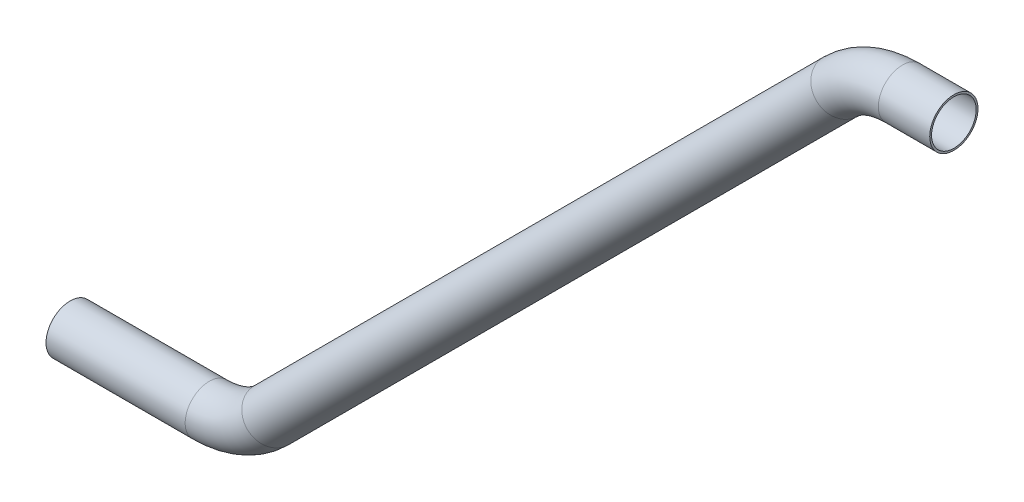
ISO-10303-21;
HEADER;
FILE_DESCRIPTION(('STEP AP214'),'2;1');
FILE_NAME('part.step','',(''),(''),'','','');
FILE_SCHEMA(('AUTOMOTIVE_DESIGN { 1 0 10303 214 1 1 1 1 }'));
ENDSEC;
DATA;
#1=APPLICATION_CONTEXT('core data for automotive mechanical design processes');
#2=APPLICATION_PROTOCOL_DEFINITION('international standard','automotive_design',2000,#1);
#3=PRODUCT_CONTEXT('',#1,'mechanical');
#4=PRODUCT('Part','Part','',(#3));
#5=PRODUCT_RELATED_PRODUCT_CATEGORY('part','',(#4));
#6=PRODUCT_DEFINITION_FORMATION('','',#4);
#7=PRODUCT_DEFINITION_CONTEXT('part definition',#1,'design');
#8=PRODUCT_DEFINITION('design','',#6,#7);
#9=PRODUCT_DEFINITION_SHAPE('','',#8);
#10=(LENGTH_UNIT() NAMED_UNIT(*) SI_UNIT(.MILLI.,.METRE.));
#11=(NAMED_UNIT(*) PLANE_ANGLE_UNIT() SI_UNIT($,.RADIAN.));
#12=(NAMED_UNIT(*) SI_UNIT($,.STERADIAN.) SOLID_ANGLE_UNIT());
#13=UNCERTAINTY_MEASURE_WITH_UNIT(LENGTH_MEASURE(1.E-05),#10,'distance_accuracy_value','');
#14=(GEOMETRIC_REPRESENTATION_CONTEXT(3) GLOBAL_UNCERTAINTY_ASSIGNED_CONTEXT((#13)) GLOBAL_UNIT_ASSIGNED_CONTEXT((#10,
#11,#12)) REPRESENTATION_CONTEXT('',''));
#15=CARTESIAN_POINT('',(0.,0.,0.));
#16=DIRECTION('',(0.,0.,1.));
#17=DIRECTION('',(1.,0.,0.));
#18=AXIS2_PLACEMENT_3D('',#15,#16,#17);
#19=CARTESIAN_POINT('',(0.,0.,0.));
#20=DIRECTION('',(-1.,0.,0.));
#21=DIRECTION('',(0.,0.,1.));
#22=AXIS2_PLACEMENT_3D('',#19,#20,#21);
#23=PLANE('',#22);
#24=CARTESIAN_POINT('',(0.,0.,0.));
#25=DIRECTION('',(-1.,0.,0.));
#26=DIRECTION('',(0.,0.,1.));
#27=AXIS2_PLACEMENT_3D('',#24,#25,#26);
#28=CIRCLE('',#27,41.275);
#29=CARTESIAN_POINT('',(0.,0.,41.275));
#30=VERTEX_POINT('',#29);
#31=EDGE_CURVE('E57',#30,#30,#28,.T.);
#32=ORIENTED_EDGE('',*,*,#31,.T.);
#33=EDGE_LOOP('',(#32));
#34=FACE_BOUND('',#33,.T.);
#35=ADVANCED_FACE('F45',(#34),#23,.T.);
#36=CARTESIAN_POINT('',(1510.66017177982,1060.66017177982,0.));
#37=DIRECTION('',(-1.,0.,0.));
#38=DIRECTION('',(0.,0.,1.));
#39=AXIS2_PLACEMENT_3D('',#36,#37,#38);
#40=PLANE('',#39);
#41=CARTESIAN_POINT('',(1510.66017177982,1060.66017177982,0.));
#42=DIRECTION('',(-1.,0.,0.));
#43=DIRECTION('',(0.,0.,1.));
#44=AXIS2_PLACEMENT_3D('',#41,#42,#43);
#45=CIRCLE('',#44,38.1);
#46=CARTESIAN_POINT('',(1510.66017177982,1060.66017177982,38.1));
#47=VERTEX_POINT('',#46);
#48=EDGE_CURVE('E136',#47,#47,#45,.T.);
#49=ORIENTED_EDGE('',*,*,#48,.T.);
#50=EDGE_LOOP('',(#49));
#51=FACE_BOUND('',#50,.T.);
#52=CARTESIAN_POINT('',(1510.66017177982,1060.66017177982,0.));
#53=DIRECTION('',(-1.,0.,0.));
#54=DIRECTION('',(0.,0.,1.));
#55=AXIS2_PLACEMENT_3D('',#52,#53,#54);
#56=CIRCLE('',#55,41.275);
#57=CARTESIAN_POINT('',(1510.66017177982,1060.66017177982,41.275));
#58=VERTEX_POINT('',#57);
#59=EDGE_CURVE('E12',#58,#58,#56,.T.);
#60=ORIENTED_EDGE('',*,*,#59,.F.);
#61=EDGE_LOOP('',(#60));
#62=FACE_BOUND('',#61,.T.);
#63=ADVANCED_FACE('F63',(#51,#62),#40,.F.);
#64=CARTESIAN_POINT('',(0.,0.,0.));
#65=DIRECTION('',(1.,0.,0.));
#66=DIRECTION('',(0.,1.,0.));
#67=AXIS2_PLACEMENT_3D('',#64,#65,#66);
#68=CYLINDRICAL_SURFACE('',#67,41.275);
#69=CARTESIAN_POINT('',(237.867965644035,0.,0.));
#70=DIRECTION('',(-1.,0.,0.));
#71=DIRECTION('',(0.,0.,1.));
#72=AXIS2_PLACEMENT_3D('',#69,#70,#71);
#73=CIRCLE('',#72,41.275);
#74=CARTESIAN_POINT('',(237.867965644035,-41.2749999999998,0.));
#75=VERTEX_POINT('',#74);
#76=EDGE_CURVE('E139',#75,#75,#73,.T.);
#77=ORIENTED_EDGE('',*,*,#76,.T.);
#78=EDGE_LOOP('',(#77));
#79=FACE_BOUND('',#78,.T.);
#80=ORIENTED_EDGE('',*,*,#31,.F.);
#81=EDGE_LOOP('',(#80));
#82=FACE_BOUND('',#81,.T.);
#83=ADVANCED_FACE('F65',(#79,#82),#68,.T.);
#84=CARTESIAN_POINT('',(237.867965644036,150.,0.));
#85=DIRECTION('',(0.,0.,1.));
#86=DIRECTION('',(1.,0.,0.));
#87=AXIS2_PLACEMENT_3D('',#84,#85,#86);
#88=TOROIDAL_SURFACE('',#87,150.,41.275);
#89=CARTESIAN_POINT('',(343.933982822018,43.933982822018,0.));
#90=DIRECTION('',(-0.707106781186546,-0.707106781186549,0.));
#91=DIRECTION('',(0.,0.,1.));
#92=AXIS2_PLACEMENT_3D('',#89,#90,#91);
#93=CIRCLE('',#92,41.275);
#94=CARTESIAN_POINT('',(373.119815215492,14.7481504285435,0.));
#95=VERTEX_POINT('',#94);
#96=EDGE_CURVE('E142',#95,#95,#93,.T.);
#97=CARTESIAN_POINT('',(237.867965644036,150.,0.));
#98=DIRECTION('',(0.,0.,1.));
#99=DIRECTION('',(1.,0.,0.));
#100=AXIS2_PLACEMENT_3D('',#97,#98,#99);
#101=CIRCLE('',#100,191.275);
#102=EDGE_CURVE('',#75,#95,#101,.T.);
#103=ORIENTED_EDGE('',*,*,#76,.F.);
#104=ORIENTED_EDGE('',*,*,#96,.T.);
#105=ORIENTED_EDGE('',*,*,#102,.T.);
#106=ORIENTED_EDGE('',*,*,#102,.F.);
#107=EDGE_LOOP('',(#103,#105,#104,#106));
#108=FACE_BOUND('',#107,.T.);
#109=ADVANCED_FACE('F71',(#108),#88,.T.);
#110=CARTESIAN_POINT('',(343.933982822018,43.933982822018,0.));
#111=DIRECTION('',(0.707106781186546,0.707106781186549,0.));
#112=DIRECTION('',(-0.707106781186549,0.707106781186546,0.));
#113=AXIS2_PLACEMENT_3D('',#110,#111,#112);
#114=CYLINDRICAL_SURFACE('',#113,41.275);
#115=CARTESIAN_POINT('',(1316.7261889578,1016.7261889578,0.));
#116=DIRECTION('',(-0.707106781186546,-0.707106781186549,0.));
#117=DIRECTION('',(0.,0.,1.));
#118=AXIS2_PLACEMENT_3D('',#115,#116,#117);
#119=CIRCLE('',#118,41.275);
#120=CARTESIAN_POINT('',(1287.54035656433,1045.91202135128,0.));
#121=VERTEX_POINT('',#120);
#122=EDGE_CURVE('E145',#121,#121,#119,.T.);
#123=ORIENTED_EDGE('',*,*,#122,.T.);
#124=EDGE_LOOP('',(#123));
#125=FACE_BOUND('',#124,.T.);
#126=ORIENTED_EDGE('',*,*,#96,.F.);
#127=EDGE_LOOP('',(#126));
#128=FACE_BOUND('',#127,.T.);
#129=ADVANCED_FACE('F88',(#125,#128),#114,.T.);
#130=CARTESIAN_POINT('',(1422.79220613578,910.660171779823,0.));
#131=DIRECTION('',(0.,0.,-1.));
#132=DIRECTION('',(-1.,0.,0.));
#133=AXIS2_PLACEMENT_3D('',#130,#131,#132);
#134=TOROIDAL_SURFACE('',#133,150.,41.275);
#135=CARTESIAN_POINT('',(1422.79220613578,1060.66017177982,0.));
#136=DIRECTION('',(-1.,0.,0.));
#137=DIRECTION('',(0.,0.,1.));
#138=AXIS2_PLACEMENT_3D('',#135,#136,#137);
#139=CIRCLE('',#138,41.275);
#140=CARTESIAN_POINT('',(1422.79220613578,1101.93517177982,0.));
#141=VERTEX_POINT('',#140);
#142=EDGE_CURVE('E52',#141,#141,#139,.T.);
#143=CARTESIAN_POINT('',(1422.79220613578,910.660171779823,0.));
#144=DIRECTION('',(0.,0.,-1.));
#145=DIRECTION('',(-1.,0.,0.));
#146=AXIS2_PLACEMENT_3D('',#143,#144,#145);
#147=CIRCLE('',#146,191.275);
#148=EDGE_CURVE('',#121,#141,#147,.T.);
#149=ORIENTED_EDGE('',*,*,#122,.F.);
#150=ORIENTED_EDGE('',*,*,#142,.T.);
#151=ORIENTED_EDGE('',*,*,#148,.T.);
#152=ORIENTED_EDGE('',*,*,#148,.F.);
#153=EDGE_LOOP('',(#149,#151,#150,#152));
#154=FACE_BOUND('',#153,.T.);
#155=ADVANCED_FACE('F80',(#154),#134,.T.);
#156=CARTESIAN_POINT('',(1422.79220613578,1060.66017177982,0.));
#157=DIRECTION('',(1.,0.,0.));
#158=DIRECTION('',(0.,0.,-1.));
#159=AXIS2_PLACEMENT_3D('',#156,#157,#158);
#160=CYLINDRICAL_SURFACE('',#159,41.275);
#161=ORIENTED_EDGE('',*,*,#59,.T.);
#162=EDGE_LOOP('',(#161));
#163=FACE_BOUND('',#162,.T.);
#164=ORIENTED_EDGE('',*,*,#142,.F.);
#165=EDGE_LOOP('',(#164));
#166=FACE_BOUND('',#165,.T.);
#167=ADVANCED_FACE('F60',(#163,#166),#160,.T.);
#168=CARTESIAN_POINT('',(3.175,0.,0.));
#169=DIRECTION('',(-1.,0.,0.));
#170=DIRECTION('',(0.,0.,1.));
#171=AXIS2_PLACEMENT_3D('',#168,#169,#170);
#172=PLANE('',#171);
#173=CARTESIAN_POINT('',(3.175,0.,0.));
#174=DIRECTION('',(-1.,0.,0.));
#175=DIRECTION('',(0.,0.,1.));
#176=AXIS2_PLACEMENT_3D('',#173,#174,#175);
#177=CIRCLE('',#176,38.1);
#178=CARTESIAN_POINT('',(3.175,0.,38.1));
#179=VERTEX_POINT('',#178);
#180=EDGE_CURVE('E123',#179,#179,#177,.T.);
#181=ORIENTED_EDGE('',*,*,#180,.F.);
#182=EDGE_LOOP('',(#181));
#183=FACE_BOUND('',#182,.T.);
#184=ADVANCED_FACE('F79',(#183),#172,.F.);
#185=CARTESIAN_POINT('',(0.,0.,0.));
#186=DIRECTION('',(1.,0.,0.));
#187=DIRECTION('',(0.,1.,0.));
#188=AXIS2_PLACEMENT_3D('',#185,#186,#187);
#189=CYLINDRICAL_SURFACE('',#188,38.1);
#190=CARTESIAN_POINT('',(237.867965644035,0.,0.));
#191=DIRECTION('',(1.,0.,0.));
#192=DIRECTION('',(0.,1.,0.));
#193=AXIS2_PLACEMENT_3D('',#190,#191,#192);
#194=CIRCLE('',#193,38.1);
#195=CARTESIAN_POINT('',(237.867965644035,-38.0999999999998,0.));
#196=VERTEX_POINT('',#195);
#197=EDGE_CURVE('E120',#196,#196,#194,.F.);
#198=ORIENTED_EDGE('',*,*,#197,.F.);
#199=EDGE_LOOP('',(#198));
#200=FACE_BOUND('',#199,.T.);
#201=ORIENTED_EDGE('',*,*,#180,.T.);
#202=EDGE_LOOP('',(#201));
#203=FACE_BOUND('',#202,.T.);
#204=ADVANCED_FACE('F85',(#200,#203),#189,.F.);
#205=CARTESIAN_POINT('',(237.867965644036,150.,0.));
#206=DIRECTION('',(0.,0.,1.));
#207=DIRECTION('',(1.,0.,0.));
#208=AXIS2_PLACEMENT_3D('',#205,#206,#207);
#209=TOROIDAL_SURFACE('',#208,150.,38.1);
#210=CARTESIAN_POINT('',(343.933982822018,43.9339828220181,0.));
#211=DIRECTION('',(-0.707106781186547,-0.707106781186548,0.));
#212=DIRECTION('',(0.707106781186548,-0.707106781186547,0.));
#213=AXIS2_PLACEMENT_3D('',#210,#211,#212);
#214=CIRCLE('',#213,38.1);
#215=CARTESIAN_POINT('',(370.874751185225,16.9932144588107,0.));
#216=VERTEX_POINT('',#215);
#217=EDGE_CURVE('E125',#216,#216,#214,.T.);
#218=CARTESIAN_POINT('',(237.867965644036,150.,0.));
#219=DIRECTION('',(0.,0.,1.));
#220=DIRECTION('',(1.,0.,0.));
#221=AXIS2_PLACEMENT_3D('',#218,#219,#220);
#222=CIRCLE('',#221,188.1);
#223=EDGE_CURVE('',#196,#216,#222,.T.);
#224=ORIENTED_EDGE('',*,*,#197,.T.);
#225=ORIENTED_EDGE('',*,*,#217,.F.);
#226=ORIENTED_EDGE('',*,*,#223,.T.);
#227=ORIENTED_EDGE('',*,*,#223,.F.);
#228=EDGE_LOOP('',(#224,#226,#225,#227));
#229=FACE_BOUND('',#228,.T.);
#230=ADVANCED_FACE('F108',(#229),#209,.F.);
#231=CARTESIAN_POINT('',(343.933982822018,43.933982822018,0.));
#232=DIRECTION('',(0.707106781186546,0.707106781186549,0.));
#233=DIRECTION('',(-0.707106781186549,0.707106781186546,0.));
#234=AXIS2_PLACEMENT_3D('',#231,#232,#233);
#235=CYLINDRICAL_SURFACE('',#234,38.1);
#236=CARTESIAN_POINT('',(1316.7261889578,1016.7261889578,0.));
#237=DIRECTION('',(0.707106781186546,0.707106781186549,0.));
#238=DIRECTION('',(-0.707106781186549,0.707106781186546,0.));
#239=AXIS2_PLACEMENT_3D('',#236,#237,#238);
#240=CIRCLE('',#239,38.1);
#241=CARTESIAN_POINT('',(1289.78542059459,1043.66695732101,0.));
#242=VERTEX_POINT('',#241);
#243=EDGE_CURVE('E130',#242,#242,#240,.F.);
#244=ORIENTED_EDGE('',*,*,#243,.F.);
#245=EDGE_LOOP('',(#244));
#246=FACE_BOUND('',#245,.T.);
#247=ORIENTED_EDGE('',*,*,#217,.T.);
#248=EDGE_LOOP('',(#247));
#249=FACE_BOUND('',#248,.T.);
#250=ADVANCED_FACE('F104',(#246,#249),#235,.F.);
#251=CARTESIAN_POINT('',(1422.79220613578,910.660171779823,0.));
#252=DIRECTION('',(0.,0.,-1.));
#253=DIRECTION('',(-1.,0.,0.));
#254=AXIS2_PLACEMENT_3D('',#251,#252,#253);
#255=TOROIDAL_SURFACE('',#254,150.,38.1);
#256=CARTESIAN_POINT('',(1422.79220613578,1060.66017177982,0.));
#257=DIRECTION('',(-1.,0.,0.));
#258=DIRECTION('',(0.,-1.,0.));
#259=AXIS2_PLACEMENT_3D('',#256,#257,#258);
#260=CIRCLE('',#259,38.1);
#261=CARTESIAN_POINT('',(1422.79220613578,1098.76017177982,0.));
#262=VERTEX_POINT('',#261);
#263=EDGE_CURVE('E133',#262,#262,#260,.T.);
#264=CARTESIAN_POINT('',(1422.79220613578,910.660171779823,0.));
#265=DIRECTION('',(0.,0.,-1.));
#266=DIRECTION('',(-1.,0.,0.));
#267=AXIS2_PLACEMENT_3D('',#264,#265,#266);
#268=CIRCLE('',#267,188.1);
#269=EDGE_CURVE('',#242,#262,#268,.T.);
#270=ORIENTED_EDGE('',*,*,#243,.T.);
#271=ORIENTED_EDGE('',*,*,#263,.F.);
#272=ORIENTED_EDGE('',*,*,#269,.T.);
#273=ORIENTED_EDGE('',*,*,#269,.F.);
#274=EDGE_LOOP('',(#270,#272,#271,#273));
#275=FACE_BOUND('',#274,.T.);
#276=ADVANCED_FACE('F100',(#275),#255,.F.);
#277=CARTESIAN_POINT('',(1422.79220613578,1060.66017177982,0.));
#278=DIRECTION('',(1.,0.,0.));
#279=DIRECTION('',(0.,0.,-1.));
#280=AXIS2_PLACEMENT_3D('',#277,#278,#279);
#281=CYLINDRICAL_SURFACE('',#280,38.1);
#282=ORIENTED_EDGE('',*,*,#48,.F.);
#283=EDGE_LOOP('',(#282));
#284=FACE_BOUND('',#283,.T.);
#285=ORIENTED_EDGE('',*,*,#263,.T.);
#286=EDGE_LOOP('',(#285));
#287=FACE_BOUND('',#286,.T.);
#288=ADVANCED_FACE('F75',(#284,#287),#281,.F.);
#289=CLOSED_SHELL('',(#35,#63,#83,#109,#129,#155,#167,#184,#204,#230,#250,#276,#288));
#290=MANIFOLD_SOLID_BREP('B2',#289);
#291=ADVANCED_BREP_SHAPE_REPRESENTATION('',(#18,#290),#14);
#292=SHAPE_DEFINITION_REPRESENTATION(#9,#291);
ENDSEC;
END-ISO-10303-21;
